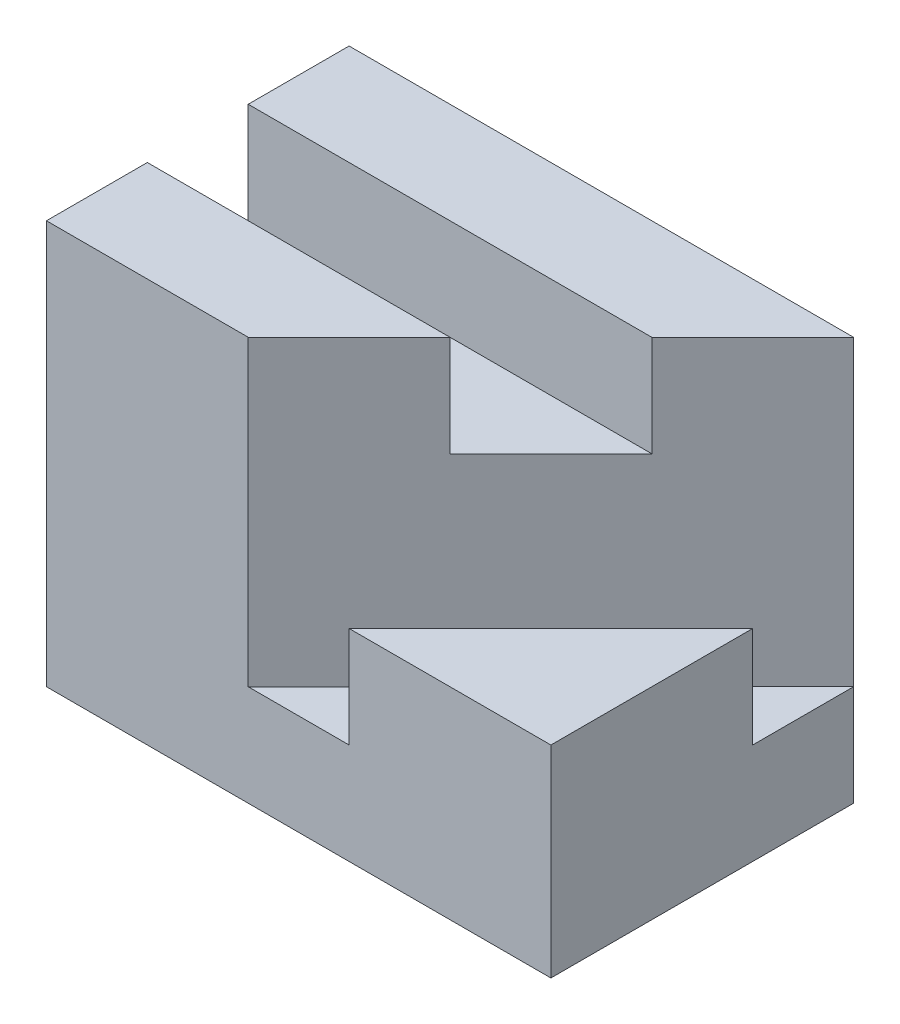
ISO-10303-21;
HEADER;
FILE_DESCRIPTION(('STEP AP214'),'2;1');
FILE_NAME('part.step','',(''),(''),'','','');
FILE_SCHEMA(('AUTOMOTIVE_DESIGN { 1 0 10303 214 1 1 1 1 }'));
ENDSEC;
DATA;
#1=APPLICATION_CONTEXT('core data for automotive mechanical design processes');
#2=APPLICATION_PROTOCOL_DEFINITION('international standard','automotive_design',2000,#1);
#3=PRODUCT_CONTEXT('',#1,'mechanical');
#4=PRODUCT('Part','Part','',(#3));
#5=PRODUCT_RELATED_PRODUCT_CATEGORY('part','',(#4));
#6=PRODUCT_DEFINITION_FORMATION('','',#4);
#7=PRODUCT_DEFINITION_CONTEXT('part definition',#1,'design');
#8=PRODUCT_DEFINITION('design','',#6,#7);
#9=PRODUCT_DEFINITION_SHAPE('','',#8);
#10=(LENGTH_UNIT() NAMED_UNIT(*) SI_UNIT(.MILLI.,.METRE.));
#11=(NAMED_UNIT(*) PLANE_ANGLE_UNIT() SI_UNIT($,.RADIAN.));
#12=(NAMED_UNIT(*) SI_UNIT($,.STERADIAN.) SOLID_ANGLE_UNIT());
#13=UNCERTAINTY_MEASURE_WITH_UNIT(LENGTH_MEASURE(1.E-05),#10,'distance_accuracy_value','');
#14=(GEOMETRIC_REPRESENTATION_CONTEXT(3) GLOBAL_UNCERTAINTY_ASSIGNED_CONTEXT((#13)) GLOBAL_UNIT_ASSIGNED_CONTEXT((#10,
#11,#12)) REPRESENTATION_CONTEXT('',''));
#15=CARTESIAN_POINT('',(0.,0.,0.));
#16=DIRECTION('',(0.,0.,1.));
#17=DIRECTION('',(1.,0.,0.));
#18=AXIS2_PLACEMENT_3D('',#15,#16,#17);
#19=CARTESIAN_POINT('',(50.,10.,13.5922330097087));
#20=DIRECTION('',(0.,-1.,0.));
#21=DIRECTION('',(0.,0.,-1.));
#22=AXIS2_PLACEMENT_3D('',#19,#20,#21);
#23=PLANE('',#22);
#24=DIRECTION('',(-1.,0.,0.));
#25=VECTOR('',#24,1.);
#26=CARTESIAN_POINT('',(50.,10.,23.5922330097087));
#27=LINE('',#26,#25);
#28=CARTESIAN_POINT('',(20.,10.,23.5922330097087));
#29=VERTEX_POINT('',#28);
#30=CARTESIAN_POINT('',(0.,10.,23.5922330097087));
#31=VERTEX_POINT('',#30);
#32=EDGE_CURVE('E11',#29,#31,#27,.T.);
#33=ORIENTED_EDGE('',*,*,#32,.F.);
#34=DIRECTION('',(-0.707106781186547,0.,0.707106781186547));
#35=VECTOR('',#34,1.);
#36=CARTESIAN_POINT('',(50.,10.,-6.40776699029126));
#37=LINE('',#36,#35);
#38=CARTESIAN_POINT('',(30.,10.,13.5922330097087));
#39=VERTEX_POINT('',#38);
#40=EDGE_CURVE('E101',#39,#29,#37,.T.);
#41=ORIENTED_EDGE('',*,*,#40,.F.);
#42=DIRECTION('',(-1.,0.,0.));
#43=VECTOR('',#42,1.);
#44=CARTESIAN_POINT('',(50.,10.,13.5922330097087));
#45=LINE('',#44,#43);
#46=CARTESIAN_POINT('',(0.,10.,13.5922330097087));
#47=VERTEX_POINT('',#46);
#48=EDGE_CURVE('E94',#39,#47,#45,.T.);
#49=ORIENTED_EDGE('',*,*,#48,.T.);
#50=DIRECTION('',(0.,0.,1.));
#51=VECTOR('',#50,1.);
#52=CARTESIAN_POINT('',(0.,10.,13.5922330097087));
#53=LINE('',#52,#51);
#54=EDGE_CURVE('E98',#47,#31,#53,.T.);
#55=ORIENTED_EDGE('',*,*,#54,.T.);
#56=EDGE_LOOP('',(#33,#41,#49,#55));
#57=FACE_BOUND('',#56,.T.);
#58=ADVANCED_FACE('F39',(#57),#23,.F.);
#59=CARTESIAN_POINT('',(50.,10.,23.5922330097087));
#60=DIRECTION('',(0.,0.,-1.));
#61=DIRECTION('',(0.,1.,0.));
#62=AXIS2_PLACEMENT_3D('',#59,#60,#61);
#63=PLANE('',#62);
#64=DIRECTION('',(1.,0.,0.));
#65=VECTOR('',#64,1.);
#66=CARTESIAN_POINT('',(30.,-10.,23.5922330097087));
#67=LINE('',#66,#65);
#68=CARTESIAN_POINT('',(30.,-10.,23.5922330097087));
#69=VERTEX_POINT('',#68);
#70=CARTESIAN_POINT('',(50.,-10.,23.5922330097087));
#71=VERTEX_POINT('',#70);
#72=EDGE_CURVE('E54',#69,#71,#67,.T.);
#73=ORIENTED_EDGE('',*,*,#72,.F.);
#74=DIRECTION('',(0.,1.,0.));
#75=VECTOR('',#74,1.);
#76=CARTESIAN_POINT('',(30.,-20.,23.5922330097087));
#77=LINE('',#76,#75);
#78=CARTESIAN_POINT('',(30.,-20.,23.5922330097087));
#79=VERTEX_POINT('',#78);
#80=EDGE_CURVE('E210',#79,#69,#77,.T.);
#81=ORIENTED_EDGE('',*,*,#80,.F.);
#82=DIRECTION('',(1.,0.,0.));
#83=VECTOR('',#82,1.);
#84=CARTESIAN_POINT('',(20.,-20.,23.5922330097087));
#85=LINE('',#84,#83);
#86=CARTESIAN_POINT('',(20.,-20.,23.5922330097087));
#87=VERTEX_POINT('',#86);
#88=EDGE_CURVE('E253',#87,#79,#85,.T.);
#89=ORIENTED_EDGE('',*,*,#88,.F.);
#90=DIRECTION('',(0.,1.,0.));
#91=VECTOR('',#90,1.);
#92=CARTESIAN_POINT('',(20.,-20.,23.5922330097087));
#93=LINE('',#92,#91);
#94=EDGE_CURVE('E214',#87,#29,#93,.T.);
#95=ORIENTED_EDGE('',*,*,#94,.T.);
#96=ORIENTED_EDGE('',*,*,#32,.T.);
#97=DIRECTION('',(0.,-1.,0.));
#98=VECTOR('',#97,1.);
#99=CARTESIAN_POINT('',(0.,10.,23.5922330097087));
#100=LINE('',#99,#98);
#101=CARTESIAN_POINT('',(0.,-30.,23.5922330097087));
#102=VERTEX_POINT('',#101);
#103=EDGE_CURVE('E122',#31,#102,#100,.T.);
#104=ORIENTED_EDGE('',*,*,#103,.T.);
#105=DIRECTION('',(-1.,0.,0.));
#106=VECTOR('',#105,1.);
#107=CARTESIAN_POINT('',(50.,-30.,23.5922330097087));
#108=LINE('',#107,#106);
#109=CARTESIAN_POINT('',(50.,-30.,23.5922330097087));
#110=VERTEX_POINT('',#109);
#111=EDGE_CURVE('E47',#110,#102,#108,.T.);
#112=ORIENTED_EDGE('',*,*,#111,.F.);
#113=DIRECTION('',(0.,-1.,0.));
#114=VECTOR('',#113,1.);
#115=CARTESIAN_POINT('',(50.,10.,23.5922330097087));
#116=LINE('',#115,#114);
#117=EDGE_CURVE('E116',#71,#110,#116,.T.);
#118=ORIENTED_EDGE('',*,*,#117,.F.);
#119=EDGE_LOOP('',(#73,#81,#89,#95,#96,#104,#112,#118));
#120=FACE_BOUND('',#119,.T.);
#121=ADVANCED_FACE('F269',(#120),#63,.F.);
#122=CARTESIAN_POINT('',(50.,-30.,23.5922330097087));
#123=DIRECTION('',(0.,1.,0.));
#124=DIRECTION('',(0.,0.,1.));
#125=AXIS2_PLACEMENT_3D('',#122,#123,#124);
#126=PLANE('',#125);
#127=DIRECTION('',(0.,0.,-1.));
#128=VECTOR('',#127,1.);
#129=CARTESIAN_POINT('',(0.,-30.,23.5922330097087));
#130=LINE('',#129,#128);
#131=CARTESIAN_POINT('',(0.,-30.,-6.40776699029126));
#132=VERTEX_POINT('',#131);
#133=EDGE_CURVE('E127',#102,#132,#130,.T.);
#134=ORIENTED_EDGE('',*,*,#133,.T.);
#135=DIRECTION('',(-1.,0.,0.));
#136=VECTOR('',#135,1.);
#137=CARTESIAN_POINT('',(50.,-30.,-6.40776699029126));
#138=LINE('',#137,#136);
#139=CARTESIAN_POINT('',(50.,-30.,-6.40776699029126));
#140=VERTEX_POINT('',#139);
#141=EDGE_CURVE('E161',#140,#132,#138,.T.);
#142=ORIENTED_EDGE('',*,*,#141,.F.);
#143=DIRECTION('',(0.,0.,-1.));
#144=VECTOR('',#143,1.);
#145=CARTESIAN_POINT('',(50.,-30.,23.5922330097087));
#146=LINE('',#145,#144);
#147=EDGE_CURVE('E63',#110,#140,#146,.T.);
#148=ORIENTED_EDGE('',*,*,#147,.F.);
#149=ORIENTED_EDGE('',*,*,#111,.T.);
#150=EDGE_LOOP('',(#134,#142,#148,#149));
#151=FACE_BOUND('',#150,.T.);
#152=ADVANCED_FACE('F168',(#151),#126,.F.);
#153=CARTESIAN_POINT('',(50.,-30.,-6.40776699029126));
#154=DIRECTION('',(0.,0.,1.));
#155=DIRECTION('',(0.,-1.,0.));
#156=AXIS2_PLACEMENT_3D('',#153,#154,#155);
#157=PLANE('',#156);
#158=DIRECTION('',(0.,1.,0.));
#159=VECTOR('',#158,1.);
#160=CARTESIAN_POINT('',(0.,-30.,-6.40776699029126));
#161=LINE('',#160,#159);
#162=CARTESIAN_POINT('',(0.,10.,-6.40776699029126));
#163=VERTEX_POINT('',#162);
#164=EDGE_CURVE('E136',#132,#163,#161,.T.);
#165=ORIENTED_EDGE('',*,*,#164,.T.);
#166=DIRECTION('',(-1.,0.,0.));
#167=VECTOR('',#166,1.);
#168=CARTESIAN_POINT('',(50.,10.,-6.40776699029126));
#169=LINE('',#168,#167);
#170=CARTESIAN_POINT('',(50.,10.,-6.40776699029126));
#171=VERTEX_POINT('',#170);
#172=EDGE_CURVE('E157',#171,#163,#169,.T.);
#173=ORIENTED_EDGE('',*,*,#172,.F.);
#174=DIRECTION('',(0.,1.,0.));
#175=VECTOR('',#174,1.);
#176=CARTESIAN_POINT('',(50.,-20.,-6.40776699029126));
#177=LINE('',#176,#175);
#178=CARTESIAN_POINT('',(50.,-20.,-6.40776699029126));
#179=VERTEX_POINT('',#178);
#180=EDGE_CURVE('E218',#179,#171,#177,.T.);
#181=ORIENTED_EDGE('',*,*,#180,.F.);
#182=DIRECTION('',(0.,1.,0.));
#183=VECTOR('',#182,1.);
#184=CARTESIAN_POINT('',(50.,-30.,-6.40776699029126));
#185=LINE('',#184,#183);
#186=EDGE_CURVE('E106',#140,#179,#185,.T.);
#187=ORIENTED_EDGE('',*,*,#186,.F.);
#188=ORIENTED_EDGE('',*,*,#141,.T.);
#189=EDGE_LOOP('',(#165,#173,#181,#187,#188));
#190=FACE_BOUND('',#189,.T.);
#191=ADVANCED_FACE('F176',(#190),#157,.F.);
#192=CARTESIAN_POINT('',(50.,10.,-6.40776699029126));
#193=DIRECTION('',(0.,-1.,0.));
#194=DIRECTION('',(0.,0.,-1.));
#195=AXIS2_PLACEMENT_3D('',#192,#193,#194);
#196=PLANE('',#195);
#197=DIRECTION('',(-1.,0.,0.));
#198=VECTOR('',#197,1.);
#199=CARTESIAN_POINT('',(50.,10.,3.59223300970874));
#200=LINE('',#199,#198);
#201=CARTESIAN_POINT('',(40.,10.,3.59223300970875));
#202=VERTEX_POINT('',#201);
#203=CARTESIAN_POINT('',(0.,10.,3.59223300970874));
#204=VERTEX_POINT('',#203);
#205=EDGE_CURVE('E154',#202,#204,#200,.T.);
#206=ORIENTED_EDGE('',*,*,#205,.F.);
#207=EDGE_CURVE('E185',#171,#202,#37,.T.);
#208=ORIENTED_EDGE('',*,*,#207,.F.);
#209=ORIENTED_EDGE('',*,*,#172,.T.);
#210=DIRECTION('',(0.,0.,1.));
#211=VECTOR('',#210,1.);
#212=CARTESIAN_POINT('',(0.,10.,-6.40776699029126));
#213=LINE('',#212,#211);
#214=EDGE_CURVE('E139',#163,#204,#213,.T.);
#215=ORIENTED_EDGE('',*,*,#214,.T.);
#216=EDGE_LOOP('',(#206,#208,#209,#215));
#217=FACE_BOUND('',#216,.T.);
#218=ADVANCED_FACE('F183',(#217),#196,.F.);
#219=CARTESIAN_POINT('',(50.,10.,3.59223300970874));
#220=DIRECTION('',(0.,0.,-1.));
#221=DIRECTION('',(0.,1.,0.));
#222=AXIS2_PLACEMENT_3D('',#219,#220,#221);
#223=PLANE('',#222);
#224=DIRECTION('',(-1.,0.,0.));
#225=VECTOR('',#224,1.);
#226=CARTESIAN_POINT('',(50.,0.,3.59223300970874));
#227=LINE('',#226,#225);
#228=CARTESIAN_POINT('',(40.,0.,3.59223300970874));
#229=VERTEX_POINT('',#228);
#230=CARTESIAN_POINT('',(0.,0.,3.59223300970874));
#231=VERTEX_POINT('',#230);
#232=EDGE_CURVE('E151',#229,#231,#227,.T.);
#233=ORIENTED_EDGE('',*,*,#232,.F.);
#234=DIRECTION('',(0.,1.,0.));
#235=VECTOR('',#234,1.);
#236=CARTESIAN_POINT('',(40.,10.,3.59223300970874));
#237=LINE('',#236,#235);
#238=EDGE_CURVE('E227',#229,#202,#237,.T.);
#239=ORIENTED_EDGE('',*,*,#238,.T.);
#240=ORIENTED_EDGE('',*,*,#205,.T.);
#241=DIRECTION('',(0.,-1.,0.));
#242=VECTOR('',#241,1.);
#243=CARTESIAN_POINT('',(0.,10.,3.59223300970874));
#244=LINE('',#243,#242);
#245=EDGE_CURVE('E143',#204,#231,#244,.T.);
#246=ORIENTED_EDGE('',*,*,#245,.T.);
#247=EDGE_LOOP('',(#233,#239,#240,#246));
#248=FACE_BOUND('',#247,.T.);
#249=ADVANCED_FACE('F284',(#248),#223,.F.);
#250=CARTESIAN_POINT('',(50.,0.,3.59223300970874));
#251=DIRECTION('',(0.,-1.,0.));
#252=DIRECTION('',(0.,0.,-1.));
#253=AXIS2_PLACEMENT_3D('',#250,#251,#252);
#254=PLANE('',#253);
#255=DIRECTION('',(-1.,0.,0.));
#256=VECTOR('',#255,1.);
#257=CARTESIAN_POINT('',(50.,0.,13.5922330097087));
#258=LINE('',#257,#256);
#259=CARTESIAN_POINT('',(30.,0.,13.5922330097087));
#260=VERTEX_POINT('',#259);
#261=CARTESIAN_POINT('',(0.,0.,13.5922330097087));
#262=VERTEX_POINT('',#261);
#263=EDGE_CURVE('E105',#260,#262,#258,.T.);
#264=ORIENTED_EDGE('',*,*,#263,.F.);
#265=DIRECTION('',(0.707106781186548,0.,-0.707106781186548));
#266=VECTOR('',#265,1.);
#267=CARTESIAN_POINT('',(45.,0.,-1.40776699029126));
#268=LINE('',#267,#266);
#269=EDGE_CURVE('E223',#260,#229,#268,.T.);
#270=ORIENTED_EDGE('',*,*,#269,.T.);
#271=ORIENTED_EDGE('',*,*,#232,.T.);
#272=DIRECTION('',(0.,0.,1.));
#273=VECTOR('',#272,1.);
#274=CARTESIAN_POINT('',(0.,0.,3.59223300970874));
#275=LINE('',#274,#273);
#276=EDGE_CURVE('E117',#231,#262,#275,.T.);
#277=ORIENTED_EDGE('',*,*,#276,.T.);
#278=EDGE_LOOP('',(#264,#270,#271,#277));
#279=FACE_BOUND('',#278,.T.);
#280=ADVANCED_FACE('F281',(#279),#254,.F.);
#281=CARTESIAN_POINT('',(50.,0.,13.5922330097087));
#282=DIRECTION('',(0.,0.,1.));
#283=DIRECTION('',(0.,-1.,0.));
#284=AXIS2_PLACEMENT_3D('',#281,#282,#283);
#285=PLANE('',#284);
#286=ORIENTED_EDGE('',*,*,#48,.F.);
#287=DIRECTION('',(0.,-1.,0.));
#288=VECTOR('',#287,1.);
#289=CARTESIAN_POINT('',(30.,0.,13.5922330097087));
#290=LINE('',#289,#288);
#291=EDGE_CURVE('E209',#39,#260,#290,.T.);
#292=ORIENTED_EDGE('',*,*,#291,.T.);
#293=ORIENTED_EDGE('',*,*,#263,.T.);
#294=DIRECTION('',(0.,1.,0.));
#295=VECTOR('',#294,1.);
#296=CARTESIAN_POINT('',(0.,0.,13.5922330097087));
#297=LINE('',#296,#295);
#298=EDGE_CURVE('E109',#262,#47,#297,.T.);
#299=ORIENTED_EDGE('',*,*,#298,.T.);
#300=EDGE_LOOP('',(#286,#292,#293,#299));
#301=FACE_BOUND('',#300,.T.);
#302=ADVANCED_FACE('F110',(#301),#285,.F.);
#303=CARTESIAN_POINT('',(50.,0.,0.));
#304=DIRECTION('',(1.,0.,0.));
#305=DIRECTION('',(0.,0.,-1.));
#306=AXIS2_PLACEMENT_3D('',#303,#304,#305);
#307=PLANE('',#306);
#308=DIRECTION('',(0.,1.,0.));
#309=VECTOR('',#308,1.);
#310=CARTESIAN_POINT('',(50.,-20.,3.59223300970874));
#311=LINE('',#310,#309);
#312=CARTESIAN_POINT('',(50.,-20.,3.59223300970874));
#313=VERTEX_POINT('',#312);
#314=CARTESIAN_POINT('',(50.,-10.,3.59223300970874));
#315=VERTEX_POINT('',#314);
#316=EDGE_CURVE('E205',#313,#315,#311,.T.);
#317=ORIENTED_EDGE('',*,*,#316,.T.);
#318=DIRECTION('',(0.,0.,-1.));
#319=VECTOR('',#318,1.);
#320=CARTESIAN_POINT('',(50.,-10.,23.5922330097087));
#321=LINE('',#320,#319);
#322=EDGE_CURVE('E230',#71,#315,#321,.T.);
#323=ORIENTED_EDGE('',*,*,#322,.F.);
#324=ORIENTED_EDGE('',*,*,#117,.T.);
#325=ORIENTED_EDGE('',*,*,#147,.T.);
#326=ORIENTED_EDGE('',*,*,#186,.T.);
#327=DIRECTION('',(0.,0.,-1.));
#328=VECTOR('',#327,1.);
#329=CARTESIAN_POINT('',(50.,-20.,-6.40776699029126));
#330=LINE('',#329,#328);
#331=EDGE_CURVE('E194',#313,#179,#330,.T.);
#332=ORIENTED_EDGE('',*,*,#331,.F.);
#333=EDGE_LOOP('',(#317,#323,#324,#325,#326,#332));
#334=FACE_BOUND('',#333,.T.);
#335=ADVANCED_FACE('F240',(#334),#307,.T.);
#336=CARTESIAN_POINT('',(0.,0.,0.));
#337=DIRECTION('',(1.,0.,0.));
#338=DIRECTION('',(0.,0.,-1.));
#339=AXIS2_PLACEMENT_3D('',#336,#337,#338);
#340=PLANE('',#339);
#341=ORIENTED_EDGE('',*,*,#54,.F.);
#342=ORIENTED_EDGE('',*,*,#298,.F.);
#343=ORIENTED_EDGE('',*,*,#276,.F.);
#344=ORIENTED_EDGE('',*,*,#245,.F.);
#345=ORIENTED_EDGE('',*,*,#214,.F.);
#346=ORIENTED_EDGE('',*,*,#164,.F.);
#347=ORIENTED_EDGE('',*,*,#133,.F.);
#348=ORIENTED_EDGE('',*,*,#103,.F.);
#349=EDGE_LOOP('',(#341,#342,#343,#344,#345,#346,#347,#348));
#350=FACE_BOUND('',#349,.T.);
#351=ADVANCED_FACE('F120',(#350),#340,.F.);
#352=CARTESIAN_POINT('',(0.,-9.99999999999999,0.));
#353=DIRECTION('',(0.,-1.,0.));
#354=DIRECTION('',(0.,0.,-1.));
#355=AXIS2_PLACEMENT_3D('',#352,#353,#354);
#356=PLANE('',#355);
#357=ORIENTED_EDGE('',*,*,#322,.T.);
#358=DIRECTION('',(-0.707106781186548,0.,0.707106781186548));
#359=VECTOR('',#358,1.);
#360=CARTESIAN_POINT('',(50.,-9.99999999999999,3.59223300970874));
#361=LINE('',#360,#359);
#362=EDGE_CURVE('E129',#315,#69,#361,.T.);
#363=ORIENTED_EDGE('',*,*,#362,.T.);
#364=ORIENTED_EDGE('',*,*,#72,.T.);
#365=EDGE_LOOP('',(#357,#363,#364));
#366=FACE_BOUND('',#365,.T.);
#367=ADVANCED_FACE('F344',(#366),#356,.F.);
#368=CARTESIAN_POINT('',(50.,-20.,-6.40776699029126));
#369=DIRECTION('',(-0.707106781186547,0.,-0.707106781186547));
#370=DIRECTION('',(-0.707106781186548,0.,0.707106781186548));
#371=AXIS2_PLACEMENT_3D('',#368,#369,#370);
#372=PLANE('',#371);
#373=ORIENTED_EDGE('',*,*,#269,.F.);
#374=ORIENTED_EDGE('',*,*,#291,.F.);
#375=ORIENTED_EDGE('',*,*,#40,.T.);
#376=ORIENTED_EDGE('',*,*,#94,.F.);
#377=DIRECTION('',(-0.707106781186547,0.,0.707106781186547));
#378=VECTOR('',#377,1.);
#379=CARTESIAN_POINT('',(50.,-20.,-6.40776699029126));
#380=LINE('',#379,#378);
#381=EDGE_CURVE('E199',#179,#87,#380,.T.);
#382=ORIENTED_EDGE('',*,*,#381,.F.);
#383=ORIENTED_EDGE('',*,*,#180,.T.);
#384=ORIENTED_EDGE('',*,*,#207,.T.);
#385=ORIENTED_EDGE('',*,*,#238,.F.);
#386=EDGE_LOOP('',(#373,#374,#375,#376,#382,#383,#384,#385));
#387=FACE_BOUND('',#386,.T.);
#388=ADVANCED_FACE('F246',(#387),#372,.F.);
#389=CARTESIAN_POINT('',(50.,-20.,3.59223300970874));
#390=DIRECTION('',(0.707106781186547,0.,0.707106781186547));
#391=DIRECTION('',(0.707106781186548,0.,-0.707106781186548));
#392=AXIS2_PLACEMENT_3D('',#389,#390,#391);
#393=PLANE('',#392);
#394=ORIENTED_EDGE('',*,*,#316,.F.);
#395=DIRECTION('',(0.707106781186548,0.,-0.707106781186548));
#396=VECTOR('',#395,1.);
#397=CARTESIAN_POINT('',(50.,-20.,3.59223300970874));
#398=LINE('',#397,#396);
#399=EDGE_CURVE('E203',#79,#313,#398,.T.);
#400=ORIENTED_EDGE('',*,*,#399,.F.);
#401=ORIENTED_EDGE('',*,*,#80,.T.);
#402=ORIENTED_EDGE('',*,*,#362,.F.);
#403=EDGE_LOOP('',(#394,#400,#401,#402));
#404=FACE_BOUND('',#403,.T.);
#405=ADVANCED_FACE('F266',(#404),#393,.F.);
#406=CARTESIAN_POINT('',(0.,-20.,0.));
#407=DIRECTION('',(0.,1.,0.));
#408=DIRECTION('',(0.,0.,1.));
#409=AXIS2_PLACEMENT_3D('',#406,#407,#408);
#410=PLANE('',#409);
#411=ORIENTED_EDGE('',*,*,#331,.T.);
#412=ORIENTED_EDGE('',*,*,#381,.T.);
#413=ORIENTED_EDGE('',*,*,#88,.T.);
#414=ORIENTED_EDGE('',*,*,#399,.T.);
#415=EDGE_LOOP('',(#411,#412,#413,#414));
#416=FACE_BOUND('',#415,.T.);
#417=ADVANCED_FACE('F256',(#416),#410,.T.);
#418=CLOSED_SHELL('',(#58,#121,#152,#191,#218,#249,#280,#302,#335,#351,#367,#388,#405,#417));
#419=MANIFOLD_SOLID_BREP('B2',#418);
#420=ADVANCED_BREP_SHAPE_REPRESENTATION('',(#18,#419),#14);
#421=SHAPE_DEFINITION_REPRESENTATION(#9,#420);
ENDSEC;
END-ISO-10303-21;
